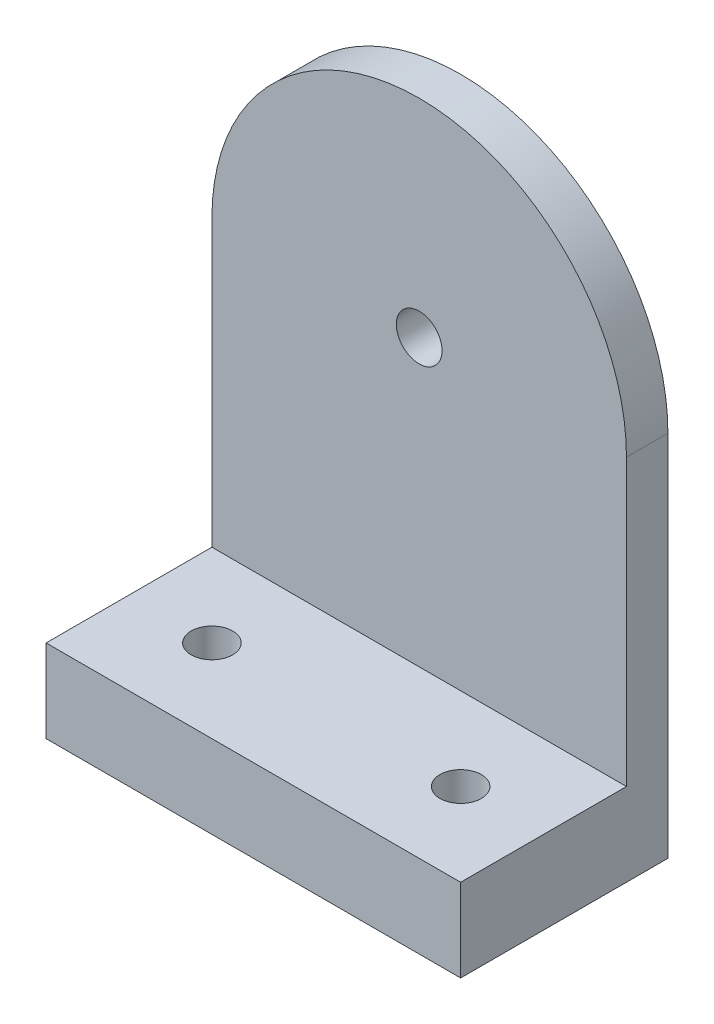
ISO-10303-21;
HEADER;
FILE_DESCRIPTION(('STEP AP214'),'2;1');
FILE_NAME('part.step','',(''),(''),'','','');
FILE_SCHEMA(('AUTOMOTIVE_DESIGN { 1 0 10303 214 1 1 1 1 }'));
ENDSEC;
DATA;
#1=APPLICATION_CONTEXT('core data for automotive mechanical design processes');
#2=APPLICATION_PROTOCOL_DEFINITION('international standard','automotive_design',2000,#1);
#3=PRODUCT_CONTEXT('',#1,'mechanical');
#4=PRODUCT('Part','Part','',(#3));
#5=PRODUCT_RELATED_PRODUCT_CATEGORY('part','',(#4));
#6=PRODUCT_DEFINITION_FORMATION('','',#4);
#7=PRODUCT_DEFINITION_CONTEXT('part definition',#1,'design');
#8=PRODUCT_DEFINITION('design','',#6,#7);
#9=PRODUCT_DEFINITION_SHAPE('','',#8);
#10=(LENGTH_UNIT() NAMED_UNIT(*) SI_UNIT(.MILLI.,.METRE.));
#11=(NAMED_UNIT(*) PLANE_ANGLE_UNIT() SI_UNIT($,.RADIAN.));
#12=(NAMED_UNIT(*) SI_UNIT($,.STERADIAN.) SOLID_ANGLE_UNIT());
#13=UNCERTAINTY_MEASURE_WITH_UNIT(LENGTH_MEASURE(1.E-05),#10,'distance_accuracy_value','');
#14=(GEOMETRIC_REPRESENTATION_CONTEXT(3) GLOBAL_UNCERTAINTY_ASSIGNED_CONTEXT((#13)) GLOBAL_UNIT_ASSIGNED_CONTEXT((#10,
#11,#12)) REPRESENTATION_CONTEXT('',''));
#15=CARTESIAN_POINT('',(0.,0.,0.));
#16=DIRECTION('',(0.,0.,1.));
#17=DIRECTION('',(1.,0.,0.));
#18=AXIS2_PLACEMENT_3D('',#15,#16,#17);
#19=CARTESIAN_POINT('',(0.,0.,3.175));
#20=DIRECTION('',(0.,0.,-1.));
#21=DIRECTION('',(-1.,0.,0.));
#22=AXIS2_PLACEMENT_3D('',#19,#20,#21);
#23=CYLINDRICAL_SURFACE('',#22,15.875);
#24=CARTESIAN_POINT('',(0.,0.,3.175));
#25=DIRECTION('',(0.,0.,1.));
#26=DIRECTION('',(1.,0.,0.));
#27=AXIS2_PLACEMENT_3D('',#24,#25,#26);
#28=CIRCLE('',#27,15.875);
#29=CARTESIAN_POINT('',(15.875,0.,3.175));
#30=VERTEX_POINT('',#29);
#31=CARTESIAN_POINT('',(-15.875,0.,3.175));
#32=VERTEX_POINT('',#31);
#33=EDGE_CURVE('E149',#30,#32,#28,.T.);
#34=ORIENTED_EDGE('',*,*,#33,.F.);
#35=DIRECTION('',(0.,0.,-1.));
#36=VECTOR('',#35,1.);
#37=CARTESIAN_POINT('',(15.875,0.,3.175));
#38=LINE('',#37,#36);
#39=CARTESIAN_POINT('',(15.875,0.,0.));
#40=VERTEX_POINT('',#39);
#41=EDGE_CURVE('E12',#30,#40,#38,.T.);
#42=ORIENTED_EDGE('',*,*,#41,.T.);
#43=CARTESIAN_POINT('',(0.,0.,0.));
#44=DIRECTION('',(0.,0.,1.));
#45=DIRECTION('',(1.,0.,0.));
#46=AXIS2_PLACEMENT_3D('',#43,#44,#45);
#47=CIRCLE('',#46,15.875);
#48=CARTESIAN_POINT('',(-15.875,0.,0.));
#49=VERTEX_POINT('',#48);
#50=EDGE_CURVE('E152',#40,#49,#47,.T.);
#51=ORIENTED_EDGE('',*,*,#50,.T.);
#52=DIRECTION('',(0.,0.,-1.));
#53=VECTOR('',#52,1.);
#54=CARTESIAN_POINT('',(-15.875,0.,3.175));
#55=LINE('',#54,#53);
#56=EDGE_CURVE('E65',#32,#49,#55,.T.);
#57=ORIENTED_EDGE('',*,*,#56,.F.);
#58=EDGE_LOOP('',(#34,#42,#51,#57));
#59=FACE_BOUND('',#58,.T.);
#60=ADVANCED_FACE('F56',(#59),#23,.T.);
#61=CARTESIAN_POINT('',(0.,0.,0.));
#62=DIRECTION('',(0.,0.,1.));
#63=DIRECTION('',(1.,0.,0.));
#64=AXIS2_PLACEMENT_3D('',#61,#62,#63);
#65=PLANE('',#64);
#66=CARTESIAN_POINT('',(0.,0.,0.));
#67=DIRECTION('',(0.,0.,1.));
#68=DIRECTION('',(1.,0.,0.));
#69=AXIS2_PLACEMENT_3D('',#66,#67,#68);
#70=CIRCLE('',#69,1.75);
#71=CARTESIAN_POINT('',(1.75,0.,0.));
#72=VERTEX_POINT('',#71);
#73=EDGE_CURVE('E217',#72,#72,#70,.T.);
#74=ORIENTED_EDGE('',*,*,#73,.T.);
#75=EDGE_LOOP('',(#74));
#76=FACE_BOUND('',#75,.T.);
#77=ORIENTED_EDGE('',*,*,#50,.F.);
#78=DIRECTION('',(0.,-1.,0.));
#79=VECTOR('',#78,1.);
#80=CARTESIAN_POINT('',(15.875,0.,0.));
#81=LINE('',#80,#79);
#82=CARTESIAN_POINT('',(15.875,-28.194,0.));
#83=VERTEX_POINT('',#82);
#84=EDGE_CURVE('E159',#40,#83,#81,.T.);
#85=ORIENTED_EDGE('',*,*,#84,.T.);
#86=DIRECTION('',(1.,0.,0.));
#87=VECTOR('',#86,1.);
#88=CARTESIAN_POINT('',(-15.875,-28.194,0.));
#89=LINE('',#88,#87);
#90=CARTESIAN_POINT('',(-15.875,-28.194,0.));
#91=VERTEX_POINT('',#90);
#92=EDGE_CURVE('E148',#91,#83,#89,.T.);
#93=ORIENTED_EDGE('',*,*,#92,.F.);
#94=DIRECTION('',(0.,-1.,0.));
#95=VECTOR('',#94,1.);
#96=CARTESIAN_POINT('',(-15.875,0.,0.));
#97=LINE('',#96,#95);
#98=EDGE_CURVE('E97',#49,#91,#97,.T.);
#99=ORIENTED_EDGE('',*,*,#98,.F.);
#100=EDGE_LOOP('',(#77,#85,#93,#99));
#101=FACE_BOUND('',#100,.T.);
#102=ADVANCED_FACE('F164',(#76,#101),#65,.F.);
#103=CARTESIAN_POINT('',(0.,0.,3.175));
#104=DIRECTION('',(0.,0.,1.));
#105=DIRECTION('',(1.,0.,0.));
#106=AXIS2_PLACEMENT_3D('',#103,#104,#105);
#107=PLANE('',#106);
#108=CARTESIAN_POINT('',(0.,0.,3.175));
#109=DIRECTION('',(0.,0.,1.));
#110=DIRECTION('',(1.,0.,0.));
#111=AXIS2_PLACEMENT_3D('',#108,#109,#110);
#112=CIRCLE('',#111,1.75);
#113=CARTESIAN_POINT('',(1.75,0.,3.175));
#114=VERTEX_POINT('',#113);
#115=EDGE_CURVE('E219',#114,#114,#112,.T.);
#116=ORIENTED_EDGE('',*,*,#115,.F.);
#117=EDGE_LOOP('',(#116));
#118=FACE_BOUND('',#117,.T.);
#119=DIRECTION('',(-1.,0.,0.));
#120=VECTOR('',#119,1.);
#121=CARTESIAN_POINT('',(-15.875,-21.844,3.175));
#122=LINE('',#121,#120);
#123=CARTESIAN_POINT('',(15.875,-21.844,3.175));
#124=VERTEX_POINT('',#123);
#125=CARTESIAN_POINT('',(-15.875,-21.844,3.175));
#126=VERTEX_POINT('',#125);
#127=EDGE_CURVE('E73',#124,#126,#122,.T.);
#128=ORIENTED_EDGE('',*,*,#127,.F.);
#129=DIRECTION('',(0.,-1.,0.));
#130=VECTOR('',#129,1.);
#131=CARTESIAN_POINT('',(15.875,0.,3.175));
#132=LINE('',#131,#130);
#133=EDGE_CURVE('E155',#30,#124,#132,.T.);
#134=ORIENTED_EDGE('',*,*,#133,.F.);
#135=ORIENTED_EDGE('',*,*,#33,.T.);
#136=DIRECTION('',(0.,-1.,0.));
#137=VECTOR('',#136,1.);
#138=CARTESIAN_POINT('',(-15.875,0.,3.175));
#139=LINE('',#138,#137);
#140=EDGE_CURVE('E123',#32,#126,#139,.T.);
#141=ORIENTED_EDGE('',*,*,#140,.T.);
#142=EDGE_LOOP('',(#128,#134,#135,#141));
#143=FACE_BOUND('',#142,.T.);
#144=ADVANCED_FACE('F170',(#118,#143),#107,.T.);
#145=CARTESIAN_POINT('',(-15.875,0.,3.175));
#146=DIRECTION('',(1.,0.,0.));
#147=DIRECTION('',(0.,1.,0.));
#148=AXIS2_PLACEMENT_3D('',#145,#146,#147);
#149=PLANE('',#148);
#150=ORIENTED_EDGE('',*,*,#98,.T.);
#151=DIRECTION('',(0.,0.,-1.));
#152=VECTOR('',#151,1.);
#153=CARTESIAN_POINT('',(-15.875,-28.194,3.175));
#154=LINE('',#153,#152);
#155=CARTESIAN_POINT('',(-15.875,-28.194,15.875));
#156=VERTEX_POINT('',#155);
#157=EDGE_CURVE('E114',#156,#91,#154,.T.);
#158=ORIENTED_EDGE('',*,*,#157,.F.);
#159=DIRECTION('',(0.,-1.,0.));
#160=VECTOR('',#159,1.);
#161=CARTESIAN_POINT('',(-15.875,-28.194,15.875));
#162=LINE('',#161,#160);
#163=CARTESIAN_POINT('',(-15.875,-21.844,15.875));
#164=VERTEX_POINT('',#163);
#165=EDGE_CURVE('E119',#164,#156,#162,.T.);
#166=ORIENTED_EDGE('',*,*,#165,.F.);
#167=DIRECTION('',(0.,0.,-1.));
#168=VECTOR('',#167,1.);
#169=CARTESIAN_POINT('',(-15.875,-21.844,15.875));
#170=LINE('',#169,#168);
#171=EDGE_CURVE('E142',#164,#126,#170,.T.);
#172=ORIENTED_EDGE('',*,*,#171,.T.);
#173=ORIENTED_EDGE('',*,*,#140,.F.);
#174=ORIENTED_EDGE('',*,*,#56,.T.);
#175=EDGE_LOOP('',(#150,#158,#166,#172,#173,#174));
#176=FACE_BOUND('',#175,.T.);
#177=ADVANCED_FACE('F116',(#176),#149,.F.);
#178=CARTESIAN_POINT('',(-15.875,-28.194,3.175));
#179=DIRECTION('',(0.,1.,0.));
#180=DIRECTION('',(0.,0.,1.));
#181=AXIS2_PLACEMENT_3D('',#178,#179,#180);
#182=PLANE('',#181);
#183=CARTESIAN_POINT('',(-9.525,-28.194,9.525));
#184=DIRECTION('',(0.,1.,0.));
#185=DIRECTION('',(0.,0.,1.));
#186=AXIS2_PLACEMENT_3D('',#183,#184,#185);
#187=CIRCLE('',#186,1.5875);
#188=CARTESIAN_POINT('',(-9.525,-28.194,11.1125));
#189=VERTEX_POINT('',#188);
#190=EDGE_CURVE('E135',#189,#189,#187,.T.);
#191=ORIENTED_EDGE('',*,*,#190,.T.);
#192=EDGE_LOOP('',(#191));
#193=FACE_BOUND('',#192,.T.);
#194=CARTESIAN_POINT('',(9.52500000000001,-28.194,9.52500000000001));
#195=DIRECTION('',(0.,1.,0.));
#196=DIRECTION('',(0.,0.,-1.));
#197=AXIS2_PLACEMENT_3D('',#194,#195,#196);
#198=CIRCLE('',#197,1.5875);
#199=CARTESIAN_POINT('',(9.52500000000001,-28.194,7.93750000000001));
#200=VERTEX_POINT('',#199);
#201=EDGE_CURVE('E138',#200,#200,#198,.T.);
#202=ORIENTED_EDGE('',*,*,#201,.T.);
#203=EDGE_LOOP('',(#202));
#204=FACE_BOUND('',#203,.T.);
#205=ORIENTED_EDGE('',*,*,#92,.T.);
#206=DIRECTION('',(0.,0.,-1.));
#207=VECTOR('',#206,1.);
#208=CARTESIAN_POINT('',(15.875,-28.194,3.175));
#209=LINE('',#208,#207);
#210=CARTESIAN_POINT('',(15.875,-28.194,15.875));
#211=VERTEX_POINT('',#210);
#212=EDGE_CURVE('E60',#211,#83,#209,.T.);
#213=ORIENTED_EDGE('',*,*,#212,.F.);
#214=DIRECTION('',(1.,0.,0.));
#215=VECTOR('',#214,1.);
#216=CARTESIAN_POINT('',(-15.875,-28.194,15.875));
#217=LINE('',#216,#215);
#218=EDGE_CURVE('E125',#156,#211,#217,.T.);
#219=ORIENTED_EDGE('',*,*,#218,.F.);
#220=ORIENTED_EDGE('',*,*,#157,.T.);
#221=EDGE_LOOP('',(#205,#213,#219,#220));
#222=FACE_BOUND('',#221,.T.);
#223=ADVANCED_FACE('F58',(#193,#204,#222),#182,.F.);
#224=CARTESIAN_POINT('',(15.875,0.,3.175));
#225=DIRECTION('',(1.,0.,0.));
#226=DIRECTION('',(0.,1.,0.));
#227=AXIS2_PLACEMENT_3D('',#224,#225,#226);
#228=PLANE('',#227);
#229=ORIENTED_EDGE('',*,*,#84,.F.);
#230=ORIENTED_EDGE('',*,*,#41,.F.);
#231=ORIENTED_EDGE('',*,*,#133,.T.);
#232=DIRECTION('',(0.,0.,-1.));
#233=VECTOR('',#232,1.);
#234=CARTESIAN_POINT('',(15.875,-21.844,15.875));
#235=LINE('',#234,#233);
#236=CARTESIAN_POINT('',(15.875,-21.844,15.875));
#237=VERTEX_POINT('',#236);
#238=EDGE_CURVE('E145',#237,#124,#235,.T.);
#239=ORIENTED_EDGE('',*,*,#238,.F.);
#240=DIRECTION('',(0.,1.,0.));
#241=VECTOR('',#240,1.);
#242=CARTESIAN_POINT('',(15.875,-28.194,15.875));
#243=LINE('',#242,#241);
#244=EDGE_CURVE('E128',#211,#237,#243,.T.);
#245=ORIENTED_EDGE('',*,*,#244,.F.);
#246=ORIENTED_EDGE('',*,*,#212,.T.);
#247=EDGE_LOOP('',(#229,#230,#231,#239,#245,#246));
#248=FACE_BOUND('',#247,.T.);
#249=ADVANCED_FACE('F166',(#248),#228,.T.);
#250=CARTESIAN_POINT('',(-15.875,-21.844,15.875));
#251=DIRECTION('',(0.,-1.,0.));
#252=DIRECTION('',(0.,0.,-1.));
#253=AXIS2_PLACEMENT_3D('',#250,#251,#252);
#254=PLANE('',#253);
#255=CARTESIAN_POINT('',(-9.525,-21.844,9.525));
#256=DIRECTION('',(0.,1.,0.));
#257=DIRECTION('',(0.,0.,1.));
#258=AXIS2_PLACEMENT_3D('',#255,#256,#257);
#259=CIRCLE('',#258,1.5875);
#260=CARTESIAN_POINT('',(-9.525,-21.844,11.1125));
#261=VERTEX_POINT('',#260);
#262=EDGE_CURVE('E224',#261,#261,#259,.T.);
#263=ORIENTED_EDGE('',*,*,#262,.F.);
#264=EDGE_LOOP('',(#263));
#265=FACE_BOUND('',#264,.T.);
#266=CARTESIAN_POINT('',(9.52500000000001,-21.844,9.52500000000001));
#267=DIRECTION('',(0.,1.,0.));
#268=DIRECTION('',(0.,0.,-1.));
#269=AXIS2_PLACEMENT_3D('',#266,#267,#268);
#270=CIRCLE('',#269,1.5875);
#271=CARTESIAN_POINT('',(9.52500000000001,-21.844,7.93750000000001));
#272=VERTEX_POINT('',#271);
#273=EDGE_CURVE('E226',#272,#272,#270,.T.);
#274=ORIENTED_EDGE('',*,*,#273,.F.);
#275=EDGE_LOOP('',(#274));
#276=FACE_BOUND('',#275,.T.);
#277=ORIENTED_EDGE('',*,*,#127,.T.);
#278=ORIENTED_EDGE('',*,*,#171,.F.);
#279=DIRECTION('',(-1.,0.,0.));
#280=VECTOR('',#279,1.);
#281=CARTESIAN_POINT('',(-15.875,-21.844,15.875));
#282=LINE('',#281,#280);
#283=EDGE_CURVE('E132',#237,#164,#282,.T.);
#284=ORIENTED_EDGE('',*,*,#283,.F.);
#285=ORIENTED_EDGE('',*,*,#238,.T.);
#286=EDGE_LOOP('',(#277,#278,#284,#285));
#287=FACE_BOUND('',#286,.T.);
#288=ADVANCED_FACE('F169',(#265,#276,#287),#254,.F.);
#289=CARTESIAN_POINT('',(0.,0.,15.875));
#290=DIRECTION('',(0.,0.,-1.));
#291=DIRECTION('',(-1.,0.,0.));
#292=AXIS2_PLACEMENT_3D('',#289,#290,#291);
#293=PLANE('',#292);
#294=ORIENTED_EDGE('',*,*,#165,.T.);
#295=ORIENTED_EDGE('',*,*,#218,.T.);
#296=ORIENTED_EDGE('',*,*,#244,.T.);
#297=ORIENTED_EDGE('',*,*,#283,.T.);
#298=EDGE_LOOP('',(#294,#295,#296,#297));
#299=FACE_BOUND('',#298,.T.);
#300=ADVANCED_FACE('F130',(#299),#293,.F.);
#301=CARTESIAN_POINT('',(9.52500000000001,-28.194,9.52500000000001));
#302=DIRECTION('',(0.,1.,0.));
#303=DIRECTION('',(0.,0.,1.));
#304=AXIS2_PLACEMENT_3D('',#301,#302,#303);
#305=CYLINDRICAL_SURFACE('',#304,1.5875);
#306=ORIENTED_EDGE('',*,*,#201,.F.);
#307=EDGE_LOOP('',(#306));
#308=FACE_BOUND('',#307,.T.);
#309=ORIENTED_EDGE('',*,*,#273,.T.);
#310=EDGE_LOOP('',(#309));
#311=FACE_BOUND('',#310,.T.);
#312=ADVANCED_FACE('F202',(#308,#311),#305,.F.);
#313=CARTESIAN_POINT('',(-9.525,-28.194,9.525));
#314=DIRECTION('',(0.,1.,0.));
#315=DIRECTION('',(0.,0.,1.));
#316=AXIS2_PLACEMENT_3D('',#313,#314,#315);
#317=CYLINDRICAL_SURFACE('',#316,1.5875);
#318=ORIENTED_EDGE('',*,*,#190,.F.);
#319=EDGE_LOOP('',(#318));
#320=FACE_BOUND('',#319,.T.);
#321=ORIENTED_EDGE('',*,*,#262,.T.);
#322=EDGE_LOOP('',(#321));
#323=FACE_BOUND('',#322,.T.);
#324=ADVANCED_FACE('F205',(#320,#323),#317,.F.);
#325=CARTESIAN_POINT('',(0.,0.,0.));
#326=DIRECTION('',(0.,0.,1.));
#327=DIRECTION('',(1.,0.,0.));
#328=AXIS2_PLACEMENT_3D('',#325,#326,#327);
#329=CYLINDRICAL_SURFACE('',#328,1.75);
#330=ORIENTED_EDGE('',*,*,#73,.F.);
#331=EDGE_LOOP('',(#330));
#332=FACE_BOUND('',#331,.T.);
#333=ORIENTED_EDGE('',*,*,#115,.T.);
#334=EDGE_LOOP('',(#333));
#335=FACE_BOUND('',#334,.T.);
#336=ADVANCED_FACE('F209',(#332,#335),#329,.F.);
#337=CLOSED_SHELL('',(#60,#102,#144,#177,#223,#249,#288,#300,#312,#324,#336));
#338=MANIFOLD_SOLID_BREP('B2',#337);
#339=ADVANCED_BREP_SHAPE_REPRESENTATION('',(#18,#338),#14);
#340=SHAPE_DEFINITION_REPRESENTATION(#9,#339);
ENDSEC;
END-ISO-10303-21;
